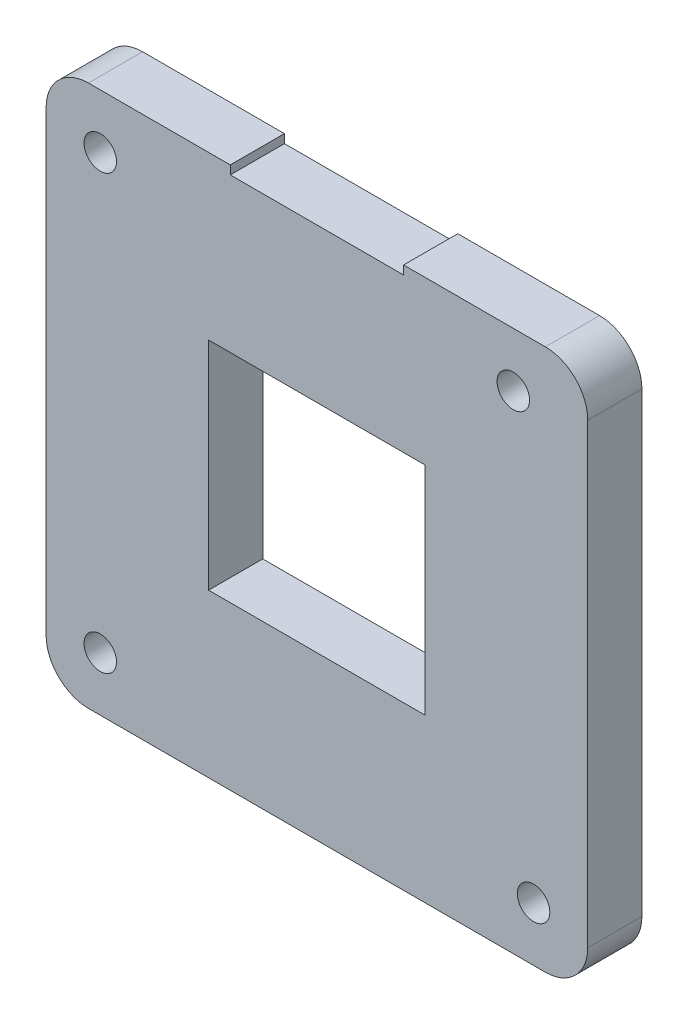
ISO-10303-21;
HEADER;
FILE_DESCRIPTION(('STEP AP214'),'2;1');
FILE_NAME('part.step','',(''),(''),'','','');
FILE_SCHEMA(('AUTOMOTIVE_DESIGN { 1 0 10303 214 1 1 1 1 }'));
ENDSEC;
DATA;
#1=APPLICATION_CONTEXT('core data for automotive mechanical design processes');
#2=APPLICATION_PROTOCOL_DEFINITION('international standard','automotive_design',2000,#1);
#3=PRODUCT_CONTEXT('',#1,'mechanical');
#4=PRODUCT('Part','Part','',(#3));
#5=PRODUCT_RELATED_PRODUCT_CATEGORY('part','',(#4));
#6=PRODUCT_DEFINITION_FORMATION('','',#4);
#7=PRODUCT_DEFINITION_CONTEXT('part definition',#1,'design');
#8=PRODUCT_DEFINITION('design','',#6,#7);
#9=PRODUCT_DEFINITION_SHAPE('','',#8);
#10=(LENGTH_UNIT() NAMED_UNIT(*) SI_UNIT(.MILLI.,.METRE.));
#11=(NAMED_UNIT(*) PLANE_ANGLE_UNIT() SI_UNIT($,.RADIAN.));
#12=(NAMED_UNIT(*) SI_UNIT($,.STERADIAN.) SOLID_ANGLE_UNIT());
#13=UNCERTAINTY_MEASURE_WITH_UNIT(LENGTH_MEASURE(1.E-05),#10,'distance_accuracy_value','');
#14=(GEOMETRIC_REPRESENTATION_CONTEXT(3) GLOBAL_UNCERTAINTY_ASSIGNED_CONTEXT((#13)) GLOBAL_UNIT_ASSIGNED_CONTEXT((#10,
#11,#12)) REPRESENTATION_CONTEXT('',''));
#15=CARTESIAN_POINT('',(0.,0.,0.));
#16=DIRECTION('',(0.,0.,1.));
#17=DIRECTION('',(1.,0.,0.));
#18=AXIS2_PLACEMENT_3D('',#15,#16,#17);
#19=CARTESIAN_POINT('',(-21.09,25.,5.));
#20=DIRECTION('',(0.,1.,0.));
#21=DIRECTION('',(0.,0.,1.));
#22=AXIS2_PLACEMENT_3D('',#19,#20,#21);
#23=PLANE('',#22);
#24=DIRECTION('',(0.,0.,-1.));
#25=VECTOR('',#24,1.);
#26=CARTESIAN_POINT('',(8.,25.,5.));
#27=LINE('',#26,#25);
#28=CARTESIAN_POINT('',(8.,25.,5.));
#29=VERTEX_POINT('',#28);
#30=CARTESIAN_POINT('',(8.,25.,0.));
#31=VERTEX_POINT('',#30);
#32=EDGE_CURVE('E195',#29,#31,#27,.T.);
#33=ORIENTED_EDGE('',*,*,#32,.F.);
#34=DIRECTION('',(1.,0.,0.));
#35=VECTOR('',#34,1.);
#36=CARTESIAN_POINT('',(-21.09,25.,5.));
#37=LINE('',#36,#35);
#38=CARTESIAN_POINT('',(21.09,25.,5.));
#39=VERTEX_POINT('',#38);
#40=EDGE_CURVE('E181',#29,#39,#37,.T.);
#41=ORIENTED_EDGE('',*,*,#40,.T.);
#42=DIRECTION('',(0.,0.,-1.));
#43=VECTOR('',#42,1.);
#44=CARTESIAN_POINT('',(21.09,25.,5.));
#45=LINE('',#44,#43);
#46=CARTESIAN_POINT('',(21.09,25.,0.));
#47=VERTEX_POINT('',#46);
#48=EDGE_CURVE('E341',#39,#47,#45,.T.);
#49=ORIENTED_EDGE('',*,*,#48,.T.);
#50=DIRECTION('',(1.,0.,0.));
#51=VECTOR('',#50,1.);
#52=CARTESIAN_POINT('',(-21.09,25.,0.));
#53=LINE('',#52,#51);
#54=EDGE_CURVE('E335',#31,#47,#53,.T.);
#55=ORIENTED_EDGE('',*,*,#54,.F.);
#56=EDGE_LOOP('',(#33,#41,#49,#55));
#57=FACE_BOUND('',#56,.T.);
#58=ADVANCED_FACE('F45',(#57),#23,.T.);
#59=CARTESIAN_POINT('',(-21.09,21.09,5.));
#60=DIRECTION('',(0.,0.,-1.));
#61=DIRECTION('',(-1.,0.,0.));
#62=AXIS2_PLACEMENT_3D('',#59,#60,#61);
#63=CYLINDRICAL_SURFACE('',#62,3.91);
#64=CARTESIAN_POINT('',(-21.09,21.09,0.));
#65=DIRECTION('',(0.,0.,1.));
#66=DIRECTION('',(1.,0.,0.));
#67=AXIS2_PLACEMENT_3D('',#64,#65,#66);
#68=CIRCLE('',#67,3.91);
#69=CARTESIAN_POINT('',(-21.09,25.,0.));
#70=VERTEX_POINT('',#69);
#71=CARTESIAN_POINT('',(-25.,21.09,0.));
#72=VERTEX_POINT('',#71);
#73=EDGE_CURVE('E270',#70,#72,#68,.T.);
#74=ORIENTED_EDGE('',*,*,#73,.T.);
#75=DIRECTION('',(0.,0.,-1.));
#76=VECTOR('',#75,1.);
#77=CARTESIAN_POINT('',(-25.,21.09,5.));
#78=LINE('',#77,#76);
#79=CARTESIAN_POINT('',(-25.,21.09,5.));
#80=VERTEX_POINT('',#79);
#81=EDGE_CURVE('E11',#80,#72,#78,.T.);
#82=ORIENTED_EDGE('',*,*,#81,.F.);
#83=CARTESIAN_POINT('',(-21.09,21.09,5.));
#84=DIRECTION('',(0.,0.,1.));
#85=DIRECTION('',(1.,0.,0.));
#86=AXIS2_PLACEMENT_3D('',#83,#84,#85);
#87=CIRCLE('',#86,3.91);
#88=CARTESIAN_POINT('',(-21.09,25.,5.));
#89=VERTEX_POINT('',#88);
#90=EDGE_CURVE('E279',#89,#80,#87,.T.);
#91=ORIENTED_EDGE('',*,*,#90,.F.);
#92=DIRECTION('',(0.,0.,-1.));
#93=VECTOR('',#92,1.);
#94=CARTESIAN_POINT('',(-21.09,25.,5.));
#95=LINE('',#94,#93);
#96=EDGE_CURVE('E309',#89,#70,#95,.T.);
#97=ORIENTED_EDGE('',*,*,#96,.T.);
#98=EDGE_LOOP('',(#74,#82,#91,#97));
#99=FACE_BOUND('',#98,.T.);
#100=ADVANCED_FACE('F47',(#99),#63,.T.);
#101=CARTESIAN_POINT('',(-25.,21.09,5.));
#102=DIRECTION('',(1.,0.,0.));
#103=DIRECTION('',(0.,1.,0.));
#104=AXIS2_PLACEMENT_3D('',#101,#102,#103);
#105=PLANE('',#104);
#106=DIRECTION('',(0.,-1.,0.));
#107=VECTOR('',#106,1.);
#108=CARTESIAN_POINT('',(-25.,21.09,0.));
#109=LINE('',#108,#107);
#110=CARTESIAN_POINT('',(-25.,-21.09,0.));
#111=VERTEX_POINT('',#110);
#112=EDGE_CURVE('E313',#72,#111,#109,.T.);
#113=ORIENTED_EDGE('',*,*,#112,.T.);
#114=DIRECTION('',(0.,0.,-1.));
#115=VECTOR('',#114,1.);
#116=CARTESIAN_POINT('',(-25.,-21.09,5.));
#117=LINE('',#116,#115);
#118=CARTESIAN_POINT('',(-25.,-21.09,5.));
#119=VERTEX_POINT('',#118);
#120=EDGE_CURVE('E54',#119,#111,#117,.T.);
#121=ORIENTED_EDGE('',*,*,#120,.F.);
#122=DIRECTION('',(0.,-1.,0.));
#123=VECTOR('',#122,1.);
#124=CARTESIAN_POINT('',(-25.,21.09,5.));
#125=LINE('',#124,#123);
#126=EDGE_CURVE('E283',#80,#119,#125,.T.);
#127=ORIENTED_EDGE('',*,*,#126,.F.);
#128=ORIENTED_EDGE('',*,*,#81,.T.);
#129=EDGE_LOOP('',(#113,#121,#127,#128));
#130=FACE_BOUND('',#129,.T.);
#131=ADVANCED_FACE('F380',(#130),#105,.F.);
#132=CARTESIAN_POINT('',(-21.09,-21.09,5.));
#133=DIRECTION('',(0.,0.,-1.));
#134=DIRECTION('',(-1.,0.,0.));
#135=AXIS2_PLACEMENT_3D('',#132,#133,#134);
#136=CYLINDRICAL_SURFACE('',#135,3.91);
#137=CARTESIAN_POINT('',(-21.09,-21.09,0.));
#138=DIRECTION('',(0.,0.,1.));
#139=DIRECTION('',(1.,0.,0.));
#140=AXIS2_PLACEMENT_3D('',#137,#138,#139);
#141=CIRCLE('',#140,3.91);
#142=CARTESIAN_POINT('',(-21.09,-25.,0.));
#143=VERTEX_POINT('',#142);
#144=EDGE_CURVE('E316',#111,#143,#141,.T.);
#145=ORIENTED_EDGE('',*,*,#144,.T.);
#146=DIRECTION('',(0.,0.,-1.));
#147=VECTOR('',#146,1.);
#148=CARTESIAN_POINT('',(-21.09,-25.,5.));
#149=LINE('',#148,#147);
#150=CARTESIAN_POINT('',(-21.09,-25.,5.));
#151=VERTEX_POINT('',#150);
#152=EDGE_CURVE('E354',#151,#143,#149,.T.);
#153=ORIENTED_EDGE('',*,*,#152,.F.);
#154=CARTESIAN_POINT('',(-21.09,-21.09,5.));
#155=DIRECTION('',(0.,0.,1.));
#156=DIRECTION('',(1.,0.,0.));
#157=AXIS2_PLACEMENT_3D('',#154,#155,#156);
#158=CIRCLE('',#157,3.91);
#159=EDGE_CURVE('E287',#119,#151,#158,.T.);
#160=ORIENTED_EDGE('',*,*,#159,.F.);
#161=ORIENTED_EDGE('',*,*,#120,.T.);
#162=EDGE_LOOP('',(#145,#153,#160,#161));
#163=FACE_BOUND('',#162,.T.);
#164=ADVANCED_FACE('F363',(#163),#136,.T.);
#165=CARTESIAN_POINT('',(21.09,-25.,5.));
#166=DIRECTION('',(0.,-1.,0.));
#167=DIRECTION('',(0.,0.,-1.));
#168=AXIS2_PLACEMENT_3D('',#165,#166,#167);
#169=PLANE('',#168);
#170=DIRECTION('',(-1.,0.,0.));
#171=VECTOR('',#170,1.);
#172=CARTESIAN_POINT('',(21.09,-25.,0.));
#173=LINE('',#172,#171);
#174=CARTESIAN_POINT('',(21.09,-25.,0.));
#175=VERTEX_POINT('',#174);
#176=EDGE_CURVE('E320',#175,#143,#173,.T.);
#177=ORIENTED_EDGE('',*,*,#176,.F.);
#178=DIRECTION('',(0.,0.,-1.));
#179=VECTOR('',#178,1.);
#180=CARTESIAN_POINT('',(21.09,-25.,5.));
#181=LINE('',#180,#179);
#182=CARTESIAN_POINT('',(21.09,-25.,5.));
#183=VERTEX_POINT('',#182);
#184=EDGE_CURVE('E351',#183,#175,#181,.T.);
#185=ORIENTED_EDGE('',*,*,#184,.F.);
#186=DIRECTION('',(1.,0.,0.));
#187=VECTOR('',#186,1.);
#188=CARTESIAN_POINT('',(-21.09,-25.,5.));
#189=LINE('',#188,#187);
#190=EDGE_CURVE('E290',#151,#183,#189,.T.);
#191=ORIENTED_EDGE('',*,*,#190,.F.);
#192=ORIENTED_EDGE('',*,*,#152,.T.);
#193=EDGE_LOOP('',(#177,#185,#191,#192));
#194=FACE_BOUND('',#193,.T.);
#195=ADVANCED_FACE('F373',(#194),#169,.T.);
#196=CARTESIAN_POINT('',(21.09,-21.09,5.));
#197=DIRECTION('',(0.,0.,-1.));
#198=DIRECTION('',(-1.,0.,0.));
#199=AXIS2_PLACEMENT_3D('',#196,#197,#198);
#200=CYLINDRICAL_SURFACE('',#199,3.91);
#201=CARTESIAN_POINT('',(21.09,-21.09,0.));
#202=DIRECTION('',(0.,0.,-1.));
#203=DIRECTION('',(-1.,0.,0.));
#204=AXIS2_PLACEMENT_3D('',#201,#202,#203);
#205=CIRCLE('',#204,3.91);
#206=CARTESIAN_POINT('',(25.,-21.09,0.));
#207=VERTEX_POINT('',#206);
#208=EDGE_CURVE('E323',#207,#175,#205,.T.);
#209=ORIENTED_EDGE('',*,*,#208,.F.);
#210=DIRECTION('',(0.,0.,-1.));
#211=VECTOR('',#210,1.);
#212=CARTESIAN_POINT('',(25.,-21.09,5.));
#213=LINE('',#212,#211);
#214=CARTESIAN_POINT('',(25.,-21.09,5.));
#215=VERTEX_POINT('',#214);
#216=EDGE_CURVE('E348',#215,#207,#213,.T.);
#217=ORIENTED_EDGE('',*,*,#216,.F.);
#218=CARTESIAN_POINT('',(21.09,-21.09,5.));
#219=DIRECTION('',(0.,0.,-1.));
#220=DIRECTION('',(-1.,0.,0.));
#221=AXIS2_PLACEMENT_3D('',#218,#219,#220);
#222=CIRCLE('',#221,3.91);
#223=EDGE_CURVE('E293',#215,#183,#222,.T.);
#224=ORIENTED_EDGE('',*,*,#223,.T.);
#225=ORIENTED_EDGE('',*,*,#184,.T.);
#226=EDGE_LOOP('',(#209,#217,#224,#225));
#227=FACE_BOUND('',#226,.T.);
#228=ADVANCED_FACE('F400',(#227),#200,.T.);
#229=CARTESIAN_POINT('',(25.,21.09,5.));
#230=DIRECTION('',(1.,0.,0.));
#231=DIRECTION('',(0.,1.,0.));
#232=AXIS2_PLACEMENT_3D('',#229,#230,#231);
#233=PLANE('',#232);
#234=DIRECTION('',(0.,-1.,0.));
#235=VECTOR('',#234,1.);
#236=CARTESIAN_POINT('',(25.,21.09,0.));
#237=LINE('',#236,#235);
#238=CARTESIAN_POINT('',(25.,21.09,0.));
#239=VERTEX_POINT('',#238);
#240=EDGE_CURVE('E327',#239,#207,#237,.T.);
#241=ORIENTED_EDGE('',*,*,#240,.F.);
#242=DIRECTION('',(0.,0.,-1.));
#243=VECTOR('',#242,1.);
#244=CARTESIAN_POINT('',(25.,21.09,5.));
#245=LINE('',#244,#243);
#246=CARTESIAN_POINT('',(25.,21.09,5.));
#247=VERTEX_POINT('',#246);
#248=EDGE_CURVE('E345',#247,#239,#245,.T.);
#249=ORIENTED_EDGE('',*,*,#248,.F.);
#250=DIRECTION('',(0.,-1.,0.));
#251=VECTOR('',#250,1.);
#252=CARTESIAN_POINT('',(25.,21.09,5.));
#253=LINE('',#252,#251);
#254=EDGE_CURVE('E297',#247,#215,#253,.T.);
#255=ORIENTED_EDGE('',*,*,#254,.T.);
#256=ORIENTED_EDGE('',*,*,#216,.T.);
#257=EDGE_LOOP('',(#241,#249,#255,#256));
#258=FACE_BOUND('',#257,.T.);
#259=ADVANCED_FACE('F398',(#258),#233,.T.);
#260=CARTESIAN_POINT('',(21.09,21.09,5.));
#261=DIRECTION('',(0.,0.,-1.));
#262=DIRECTION('',(-1.,0.,0.));
#263=AXIS2_PLACEMENT_3D('',#260,#261,#262);
#264=CYLINDRICAL_SURFACE('',#263,3.91);
#265=CARTESIAN_POINT('',(21.09,21.09,0.));
#266=DIRECTION('',(0.,0.,-1.));
#267=DIRECTION('',(-1.,0.,0.));
#268=AXIS2_PLACEMENT_3D('',#265,#266,#267);
#269=CIRCLE('',#268,3.91);
#270=EDGE_CURVE('E331',#47,#239,#269,.T.);
#271=ORIENTED_EDGE('',*,*,#270,.F.);
#272=ORIENTED_EDGE('',*,*,#48,.F.);
#273=CARTESIAN_POINT('',(21.09,21.09,5.));
#274=DIRECTION('',(0.,0.,-1.));
#275=DIRECTION('',(-1.,0.,0.));
#276=AXIS2_PLACEMENT_3D('',#273,#274,#275);
#277=CIRCLE('',#276,3.91);
#278=EDGE_CURVE('E301',#39,#247,#277,.T.);
#279=ORIENTED_EDGE('',*,*,#278,.T.);
#280=ORIENTED_EDGE('',*,*,#248,.T.);
#281=EDGE_LOOP('',(#271,#272,#279,#280));
#282=FACE_BOUND('',#281,.T.);
#283=ADVANCED_FACE('F395',(#282),#264,.T.);
#284=DIRECTION('',(0.,0.,-1.));
#285=VECTOR('',#284,1.);
#286=CARTESIAN_POINT('',(-8.,25.,5.));
#287=LINE('',#286,#285);
#288=CARTESIAN_POINT('',(-8.,25.,5.));
#289=VERTEX_POINT('',#288);
#290=CARTESIAN_POINT('',(-8.,25.,0.));
#291=VERTEX_POINT('',#290);
#292=EDGE_CURVE('E199',#289,#291,#287,.T.);
#293=ORIENTED_EDGE('',*,*,#292,.T.);
#294=EDGE_CURVE('E284',#70,#291,#53,.T.);
#295=ORIENTED_EDGE('',*,*,#294,.F.);
#296=ORIENTED_EDGE('',*,*,#96,.F.);
#297=EDGE_CURVE('E305',#89,#289,#37,.T.);
#298=ORIENTED_EDGE('',*,*,#297,.T.);
#299=EDGE_LOOP('',(#293,#295,#296,#298));
#300=FACE_BOUND('',#299,.T.);
#301=ADVANCED_FACE('F385',(#300),#23,.T.);
#302=CARTESIAN_POINT('',(-21.09,21.09,5.));
#303=DIRECTION('',(0.,0.,1.));
#304=DIRECTION('',(1.,0.,0.));
#305=AXIS2_PLACEMENT_3D('',#302,#303,#304);
#306=PLANE('',#305);
#307=DIRECTION('',(0.,-1.,0.));
#308=VECTOR('',#307,1.);
#309=CARTESIAN_POINT('',(8.,25.,5.));
#310=LINE('',#309,#308);
#311=CARTESIAN_POINT('',(8.,24.2,5.));
#312=VERTEX_POINT('',#311);
#313=EDGE_CURVE('E160',#29,#312,#310,.T.);
#314=ORIENTED_EDGE('',*,*,#313,.T.);
#315=DIRECTION('',(-1.,0.,0.));
#316=VECTOR('',#315,1.);
#317=CARTESIAN_POINT('',(8.,24.2,5.));
#318=LINE('',#317,#316);
#319=CARTESIAN_POINT('',(-8.,24.2,5.));
#320=VERTEX_POINT('',#319);
#321=EDGE_CURVE('E170',#312,#320,#318,.T.);
#322=ORIENTED_EDGE('',*,*,#321,.T.);
#323=DIRECTION('',(0.,1.,0.));
#324=VECTOR('',#323,1.);
#325=CARTESIAN_POINT('',(-8.,25.,5.));
#326=LINE('',#325,#324);
#327=EDGE_CURVE('E167',#320,#289,#326,.T.);
#328=ORIENTED_EDGE('',*,*,#327,.T.);
#329=ORIENTED_EDGE('',*,*,#297,.F.);
#330=ORIENTED_EDGE('',*,*,#90,.T.);
#331=ORIENTED_EDGE('',*,*,#126,.T.);
#332=ORIENTED_EDGE('',*,*,#159,.T.);
#333=ORIENTED_EDGE('',*,*,#190,.T.);
#334=ORIENTED_EDGE('',*,*,#223,.F.);
#335=ORIENTED_EDGE('',*,*,#254,.F.);
#336=ORIENTED_EDGE('',*,*,#278,.F.);
#337=ORIENTED_EDGE('',*,*,#40,.F.);
#338=EDGE_LOOP('',(#314,#322,#328,#329,#330,#331,#332,#333,#334,#335,#336,#337));
#339=FACE_BOUND('',#338,.T.);
#340=CARTESIAN_POINT('',(-20.,-20.,5.));
#341=DIRECTION('',(0.,0.,1.));
#342=DIRECTION('',(1.,0.,0.));
#343=AXIS2_PLACEMENT_3D('',#340,#341,#342);
#344=CIRCLE('',#343,1.5);
#345=CARTESIAN_POINT('',(-18.5,-20.,5.));
#346=VERTEX_POINT('',#345);
#347=EDGE_CURVE('E222',#346,#346,#344,.T.);
#348=ORIENTED_EDGE('',*,*,#347,.F.);
#349=EDGE_LOOP('',(#348));
#350=FACE_BOUND('',#349,.T.);
#351=CARTESIAN_POINT('',(20.,-20.,5.));
#352=DIRECTION('',(0.,0.,1.));
#353=DIRECTION('',(1.,0.,0.));
#354=AXIS2_PLACEMENT_3D('',#351,#352,#353);
#355=CIRCLE('',#354,1.5);
#356=CARTESIAN_POINT('',(21.5,-20.,5.));
#357=VERTEX_POINT('',#356);
#358=EDGE_CURVE('E214',#357,#357,#355,.T.);
#359=ORIENTED_EDGE('',*,*,#358,.F.);
#360=EDGE_LOOP('',(#359));
#361=FACE_BOUND('',#360,.T.);
#362=CARTESIAN_POINT('',(18.1305420500507,20.,5.));
#363=DIRECTION('',(0.,0.,1.));
#364=DIRECTION('',(1.,0.,0.));
#365=AXIS2_PLACEMENT_3D('',#362,#363,#364);
#366=CIRCLE('',#365,1.5);
#367=CARTESIAN_POINT('',(19.6305420500507,20.,5.));
#368=VERTEX_POINT('',#367);
#369=EDGE_CURVE('E205',#368,#368,#366,.T.);
#370=ORIENTED_EDGE('',*,*,#369,.F.);
#371=EDGE_LOOP('',(#370));
#372=FACE_BOUND('',#371,.T.);
#373=CARTESIAN_POINT('',(-20.,20.,5.));
#374=DIRECTION('',(0.,0.,1.));
#375=DIRECTION('',(1.,0.,0.));
#376=AXIS2_PLACEMENT_3D('',#373,#374,#375);
#377=CIRCLE('',#376,1.5);
#378=CARTESIAN_POINT('',(-18.5,20.,5.));
#379=VERTEX_POINT('',#378);
#380=EDGE_CURVE('E209',#379,#379,#377,.T.);
#381=ORIENTED_EDGE('',*,*,#380,.F.);
#382=EDGE_LOOP('',(#381));
#383=FACE_BOUND('',#382,.T.);
#384=DIRECTION('',(0.,-1.,0.));
#385=VECTOR('',#384,1.);
#386=CARTESIAN_POINT('',(-10.,10.,5.));
#387=LINE('',#386,#385);
#388=CARTESIAN_POINT('',(-10.,10.,5.));
#389=VERTEX_POINT('',#388);
#390=CARTESIAN_POINT('',(-10.,-10.,5.));
#391=VERTEX_POINT('',#390);
#392=EDGE_CURVE('E69',#389,#391,#387,.T.);
#393=ORIENTED_EDGE('',*,*,#392,.F.);
#394=DIRECTION('',(-1.,0.,0.));
#395=VECTOR('',#394,1.);
#396=CARTESIAN_POINT('',(10.,10.,5.));
#397=LINE('',#396,#395);
#398=CARTESIAN_POINT('',(10.,10.,5.));
#399=VERTEX_POINT('',#398);
#400=EDGE_CURVE('E241',#399,#389,#397,.T.);
#401=ORIENTED_EDGE('',*,*,#400,.F.);
#402=DIRECTION('',(0.,1.,0.));
#403=VECTOR('',#402,1.);
#404=CARTESIAN_POINT('',(10.,-10.,5.));
#405=LINE('',#404,#403);
#406=CARTESIAN_POINT('',(10.,-10.,5.));
#407=VERTEX_POINT('',#406);
#408=EDGE_CURVE('E260',#407,#399,#405,.T.);
#409=ORIENTED_EDGE('',*,*,#408,.F.);
#410=DIRECTION('',(1.,0.,0.));
#411=VECTOR('',#410,1.);
#412=CARTESIAN_POINT('',(-10.,-10.,5.));
#413=LINE('',#412,#411);
#414=EDGE_CURVE('E256',#391,#407,#413,.T.);
#415=ORIENTED_EDGE('',*,*,#414,.F.);
#416=EDGE_LOOP('',(#393,#401,#409,#415));
#417=FACE_BOUND('',#416,.T.);
#418=ADVANCED_FACE('F178',(#339,#350,#361,#372,#383,#417),#306,.T.);
#419=CARTESIAN_POINT('',(-21.09,21.09,0.));
#420=DIRECTION('',(0.,0.,1.));
#421=DIRECTION('',(1.,0.,0.));
#422=AXIS2_PLACEMENT_3D('',#419,#420,#421);
#423=PLANE('',#422);
#424=CARTESIAN_POINT('',(-20.,-20.,0.));
#425=DIRECTION('',(0.,0.,1.));
#426=DIRECTION('',(1.,0.,0.));
#427=AXIS2_PLACEMENT_3D('',#424,#425,#426);
#428=CIRCLE('',#427,1.5);
#429=CARTESIAN_POINT('',(-18.5,-20.,0.));
#430=VERTEX_POINT('',#429);
#431=EDGE_CURVE('E198',#430,#430,#428,.T.);
#432=ORIENTED_EDGE('',*,*,#431,.T.);
#433=EDGE_LOOP('',(#432));
#434=FACE_BOUND('',#433,.T.);
#435=CARTESIAN_POINT('',(20.,-20.,0.));
#436=DIRECTION('',(0.,0.,1.));
#437=DIRECTION('',(1.,0.,0.));
#438=AXIS2_PLACEMENT_3D('',#435,#436,#437);
#439=CIRCLE('',#438,1.5);
#440=CARTESIAN_POINT('',(21.5,-20.,0.));
#441=VERTEX_POINT('',#440);
#442=EDGE_CURVE('E218',#441,#441,#439,.T.);
#443=ORIENTED_EDGE('',*,*,#442,.T.);
#444=EDGE_LOOP('',(#443));
#445=FACE_BOUND('',#444,.T.);
#446=CARTESIAN_POINT('',(18.1305420500507,20.,0.));
#447=DIRECTION('',(0.,0.,1.));
#448=DIRECTION('',(1.,0.,0.));
#449=AXIS2_PLACEMENT_3D('',#446,#447,#448);
#450=CIRCLE('',#449,1.5);
#451=CARTESIAN_POINT('',(19.6305420500507,20.,0.));
#452=VERTEX_POINT('',#451);
#453=EDGE_CURVE('E210',#452,#452,#450,.T.);
#454=ORIENTED_EDGE('',*,*,#453,.T.);
#455=EDGE_LOOP('',(#454));
#456=FACE_BOUND('',#455,.T.);
#457=CARTESIAN_POINT('',(-20.,20.,0.));
#458=DIRECTION('',(0.,0.,1.));
#459=DIRECTION('',(1.,0.,0.));
#460=AXIS2_PLACEMENT_3D('',#457,#458,#459);
#461=CIRCLE('',#460,1.5);
#462=CARTESIAN_POINT('',(-18.5,20.,0.));
#463=VERTEX_POINT('',#462);
#464=EDGE_CURVE('E229',#463,#463,#461,.T.);
#465=ORIENTED_EDGE('',*,*,#464,.T.);
#466=EDGE_LOOP('',(#465));
#467=FACE_BOUND('',#466,.T.);
#468=DIRECTION('',(-1.,0.,0.));
#469=VECTOR('',#468,1.);
#470=CARTESIAN_POINT('',(10.,10.,0.));
#471=LINE('',#470,#469);
#472=CARTESIAN_POINT('',(10.,10.,0.));
#473=VERTEX_POINT('',#472);
#474=CARTESIAN_POINT('',(-10.,10.,0.));
#475=VERTEX_POINT('',#474);
#476=EDGE_CURVE('E249',#473,#475,#471,.T.);
#477=ORIENTED_EDGE('',*,*,#476,.T.);
#478=DIRECTION('',(0.,-1.,0.));
#479=VECTOR('',#478,1.);
#480=CARTESIAN_POINT('',(-10.,10.,0.));
#481=LINE('',#480,#479);
#482=CARTESIAN_POINT('',(-10.,-10.,0.));
#483=VERTEX_POINT('',#482);
#484=EDGE_CURVE('E236',#475,#483,#481,.T.);
#485=ORIENTED_EDGE('',*,*,#484,.T.);
#486=DIRECTION('',(1.,0.,0.));
#487=VECTOR('',#486,1.);
#488=CARTESIAN_POINT('',(-10.,-10.,0.));
#489=LINE('',#488,#487);
#490=CARTESIAN_POINT('',(10.,-10.,0.));
#491=VERTEX_POINT('',#490);
#492=EDGE_CURVE('E240',#483,#491,#489,.T.);
#493=ORIENTED_EDGE('',*,*,#492,.T.);
#494=DIRECTION('',(0.,1.,0.));
#495=VECTOR('',#494,1.);
#496=CARTESIAN_POINT('',(10.,-10.,0.));
#497=LINE('',#496,#495);
#498=EDGE_CURVE('E245',#491,#473,#497,.T.);
#499=ORIENTED_EDGE('',*,*,#498,.T.);
#500=EDGE_LOOP('',(#477,#485,#493,#499));
#501=FACE_BOUND('',#500,.T.);
#502=DIRECTION('',(-1.,0.,0.));
#503=VECTOR('',#502,1.);
#504=CARTESIAN_POINT('',(8.,24.2,0.));
#505=LINE('',#504,#503);
#506=CARTESIAN_POINT('',(8.,24.2,0.));
#507=VERTEX_POINT('',#506);
#508=CARTESIAN_POINT('',(-8.,24.2,0.));
#509=VERTEX_POINT('',#508);
#510=EDGE_CURVE('E186',#507,#509,#505,.T.);
#511=ORIENTED_EDGE('',*,*,#510,.F.);
#512=DIRECTION('',(0.,-1.,0.));
#513=VECTOR('',#512,1.);
#514=CARTESIAN_POINT('',(8.,25.,0.));
#515=LINE('',#514,#513);
#516=EDGE_CURVE('E61',#31,#507,#515,.T.);
#517=ORIENTED_EDGE('',*,*,#516,.F.);
#518=ORIENTED_EDGE('',*,*,#54,.T.);
#519=ORIENTED_EDGE('',*,*,#270,.T.);
#520=ORIENTED_EDGE('',*,*,#240,.T.);
#521=ORIENTED_EDGE('',*,*,#208,.T.);
#522=ORIENTED_EDGE('',*,*,#176,.T.);
#523=ORIENTED_EDGE('',*,*,#144,.F.);
#524=ORIENTED_EDGE('',*,*,#112,.F.);
#525=ORIENTED_EDGE('',*,*,#73,.F.);
#526=ORIENTED_EDGE('',*,*,#294,.T.);
#527=DIRECTION('',(0.,1.,0.));
#528=VECTOR('',#527,1.);
#529=CARTESIAN_POINT('',(-8.,25.,0.));
#530=LINE('',#529,#528);
#531=EDGE_CURVE('E183',#509,#291,#530,.T.);
#532=ORIENTED_EDGE('',*,*,#531,.F.);
#533=EDGE_LOOP('',(#511,#517,#518,#519,#520,#521,#522,#523,#524,#525,#526,#532));
#534=FACE_BOUND('',#533,.T.);
#535=ADVANCED_FACE('F367',(#434,#445,#456,#467,#501,#534),#423,.F.);
#536=CARTESIAN_POINT('',(-10.,10.,0.));
#537=DIRECTION('',(-1.,0.,0.));
#538=DIRECTION('',(0.,0.,1.));
#539=AXIS2_PLACEMENT_3D('',#536,#537,#538);
#540=PLANE('',#539);
#541=ORIENTED_EDGE('',*,*,#392,.T.);
#542=DIRECTION('',(0.,0.,1.));
#543=VECTOR('',#542,1.);
#544=CARTESIAN_POINT('',(-10.,-10.,0.));
#545=LINE('',#544,#543);
#546=EDGE_CURVE('E253',#483,#391,#545,.T.);
#547=ORIENTED_EDGE('',*,*,#546,.F.);
#548=ORIENTED_EDGE('',*,*,#484,.F.);
#549=DIRECTION('',(0.,0.,1.));
#550=VECTOR('',#549,1.);
#551=CARTESIAN_POINT('',(-10.,10.,0.));
#552=LINE('',#551,#550);
#553=EDGE_CURVE('E267',#475,#389,#552,.T.);
#554=ORIENTED_EDGE('',*,*,#553,.T.);
#555=EDGE_LOOP('',(#541,#547,#548,#554));
#556=FACE_BOUND('',#555,.T.);
#557=ADVANCED_FACE('F431',(#556),#540,.F.);
#558=CARTESIAN_POINT('',(10.,10.,0.));
#559=DIRECTION('',(0.,1.,0.));
#560=DIRECTION('',(0.,0.,1.));
#561=AXIS2_PLACEMENT_3D('',#558,#559,#560);
#562=PLANE('',#561);
#563=ORIENTED_EDGE('',*,*,#400,.T.);
#564=ORIENTED_EDGE('',*,*,#553,.F.);
#565=ORIENTED_EDGE('',*,*,#476,.F.);
#566=DIRECTION('',(0.,0.,1.));
#567=VECTOR('',#566,1.);
#568=CARTESIAN_POINT('',(10.,10.,0.));
#569=LINE('',#568,#567);
#570=EDGE_CURVE('E271',#473,#399,#569,.T.);
#571=ORIENTED_EDGE('',*,*,#570,.T.);
#572=EDGE_LOOP('',(#563,#564,#565,#571));
#573=FACE_BOUND('',#572,.T.);
#574=ADVANCED_FACE('F435',(#573),#562,.F.);
#575=CARTESIAN_POINT('',(10.,-10.,0.));
#576=DIRECTION('',(1.,0.,0.));
#577=DIRECTION('',(0.,1.,0.));
#578=AXIS2_PLACEMENT_3D('',#575,#576,#577);
#579=PLANE('',#578);
#580=ORIENTED_EDGE('',*,*,#408,.T.);
#581=ORIENTED_EDGE('',*,*,#570,.F.);
#582=ORIENTED_EDGE('',*,*,#498,.F.);
#583=DIRECTION('',(0.,0.,1.));
#584=VECTOR('',#583,1.);
#585=CARTESIAN_POINT('',(10.,-10.,0.));
#586=LINE('',#585,#584);
#587=EDGE_CURVE('E274',#491,#407,#586,.T.);
#588=ORIENTED_EDGE('',*,*,#587,.T.);
#589=EDGE_LOOP('',(#580,#581,#582,#588));
#590=FACE_BOUND('',#589,.T.);
#591=ADVANCED_FACE('F444',(#590),#579,.F.);
#592=CARTESIAN_POINT('',(-10.,-10.,0.));
#593=DIRECTION('',(0.,-1.,0.));
#594=DIRECTION('',(0.,0.,-1.));
#595=AXIS2_PLACEMENT_3D('',#592,#593,#594);
#596=PLANE('',#595);
#597=ORIENTED_EDGE('',*,*,#414,.T.);
#598=ORIENTED_EDGE('',*,*,#587,.F.);
#599=ORIENTED_EDGE('',*,*,#492,.F.);
#600=ORIENTED_EDGE('',*,*,#546,.T.);
#601=EDGE_LOOP('',(#597,#598,#599,#600));
#602=FACE_BOUND('',#601,.T.);
#603=ADVANCED_FACE('F453',(#602),#596,.F.);
#604=CARTESIAN_POINT('',(-20.,20.,0.));
#605=DIRECTION('',(0.,0.,1.));
#606=DIRECTION('',(1.,0.,0.));
#607=AXIS2_PLACEMENT_3D('',#604,#605,#606);
#608=CYLINDRICAL_SURFACE('',#607,1.5);
#609=ORIENTED_EDGE('',*,*,#464,.F.);
#610=EDGE_LOOP('',(#609));
#611=FACE_BOUND('',#610,.T.);
#612=ORIENTED_EDGE('',*,*,#380,.T.);
#613=EDGE_LOOP('',(#612));
#614=FACE_BOUND('',#613,.T.);
#615=ADVANCED_FACE('F462',(#611,#614),#608,.F.);
#616=CARTESIAN_POINT('',(18.1305420500507,20.,0.));
#617=DIRECTION('',(0.,0.,1.));
#618=DIRECTION('',(1.,0.,0.));
#619=AXIS2_PLACEMENT_3D('',#616,#617,#618);
#620=CYLINDRICAL_SURFACE('',#619,1.5);
#621=ORIENTED_EDGE('',*,*,#453,.F.);
#622=EDGE_LOOP('',(#621));
#623=FACE_BOUND('',#622,.T.);
#624=ORIENTED_EDGE('',*,*,#369,.T.);
#625=EDGE_LOOP('',(#624));
#626=FACE_BOUND('',#625,.T.);
#627=ADVANCED_FACE('F471',(#623,#626),#620,.F.);
#628=CARTESIAN_POINT('',(20.,-20.,0.));
#629=DIRECTION('',(0.,0.,1.));
#630=DIRECTION('',(1.,0.,0.));
#631=AXIS2_PLACEMENT_3D('',#628,#629,#630);
#632=CYLINDRICAL_SURFACE('',#631,1.5);
#633=ORIENTED_EDGE('',*,*,#442,.F.);
#634=EDGE_LOOP('',(#633));
#635=FACE_BOUND('',#634,.T.);
#636=ORIENTED_EDGE('',*,*,#358,.T.);
#637=EDGE_LOOP('',(#636));
#638=FACE_BOUND('',#637,.T.);
#639=ADVANCED_FACE('F480',(#635,#638),#632,.F.);
#640=CARTESIAN_POINT('',(-20.,-20.,0.));
#641=DIRECTION('',(0.,0.,1.));
#642=DIRECTION('',(1.,0.,0.));
#643=AXIS2_PLACEMENT_3D('',#640,#641,#642);
#644=CYLINDRICAL_SURFACE('',#643,1.5);
#645=ORIENTED_EDGE('',*,*,#431,.F.);
#646=EDGE_LOOP('',(#645));
#647=FACE_BOUND('',#646,.T.);
#648=ORIENTED_EDGE('',*,*,#347,.T.);
#649=EDGE_LOOP('',(#648));
#650=FACE_BOUND('',#649,.T.);
#651=ADVANCED_FACE('F488',(#647,#650),#644,.F.);
#652=CARTESIAN_POINT('',(8.,25.,5.));
#653=DIRECTION('',(1.,0.,0.));
#654=DIRECTION('',(0.,0.,-1.));
#655=AXIS2_PLACEMENT_3D('',#652,#653,#654);
#656=PLANE('',#655);
#657=ORIENTED_EDGE('',*,*,#516,.T.);
#658=DIRECTION('',(0.,0.,-1.));
#659=VECTOR('',#658,1.);
#660=CARTESIAN_POINT('',(8.,24.2,5.));
#661=LINE('',#660,#659);
#662=EDGE_CURVE('E156',#312,#507,#661,.T.);
#663=ORIENTED_EDGE('',*,*,#662,.F.);
#664=ORIENTED_EDGE('',*,*,#313,.F.);
#665=ORIENTED_EDGE('',*,*,#32,.T.);
#666=EDGE_LOOP('',(#657,#663,#664,#665));
#667=FACE_BOUND('',#666,.T.);
#668=ADVANCED_FACE('F158',(#667),#656,.F.);
#669=CARTESIAN_POINT('',(-8.,25.,5.));
#670=DIRECTION('',(-1.,0.,0.));
#671=DIRECTION('',(0.,0.,1.));
#672=AXIS2_PLACEMENT_3D('',#669,#670,#671);
#673=PLANE('',#672);
#674=ORIENTED_EDGE('',*,*,#531,.T.);
#675=ORIENTED_EDGE('',*,*,#292,.F.);
#676=ORIENTED_EDGE('',*,*,#327,.F.);
#677=DIRECTION('',(0.,0.,-1.));
#678=VECTOR('',#677,1.);
#679=CARTESIAN_POINT('',(-8.,24.2,5.));
#680=LINE('',#679,#678);
#681=EDGE_CURVE('E166',#320,#509,#680,.T.);
#682=ORIENTED_EDGE('',*,*,#681,.T.);
#683=EDGE_LOOP('',(#674,#675,#676,#682));
#684=FACE_BOUND('',#683,.T.);
#685=ADVANCED_FACE('F387',(#684),#673,.F.);
#686=CARTESIAN_POINT('',(8.,24.2,5.));
#687=DIRECTION('',(0.,-1.,0.));
#688=DIRECTION('',(0.,0.,-1.));
#689=AXIS2_PLACEMENT_3D('',#686,#687,#688);
#690=PLANE('',#689);
#691=ORIENTED_EDGE('',*,*,#510,.T.);
#692=ORIENTED_EDGE('',*,*,#681,.F.);
#693=ORIENTED_EDGE('',*,*,#321,.F.);
#694=ORIENTED_EDGE('',*,*,#662,.T.);
#695=EDGE_LOOP('',(#691,#692,#693,#694));
#696=FACE_BOUND('',#695,.T.);
#697=ADVANCED_FACE('F171',(#696),#690,.F.);
#698=CLOSED_SHELL('',(#58,#100,#131,#164,#195,#228,#259,#283,#301,#418,#535,#557,#574,#591,#603,
#615,#627,#639,#651,#668,#685,#697));
#699=MANIFOLD_SOLID_BREP('B2',#698);
#700=ADVANCED_BREP_SHAPE_REPRESENTATION('',(#18,#699),#14);
#701=SHAPE_DEFINITION_REPRESENTATION(#9,#700);
ENDSEC;
END-ISO-10303-21;
